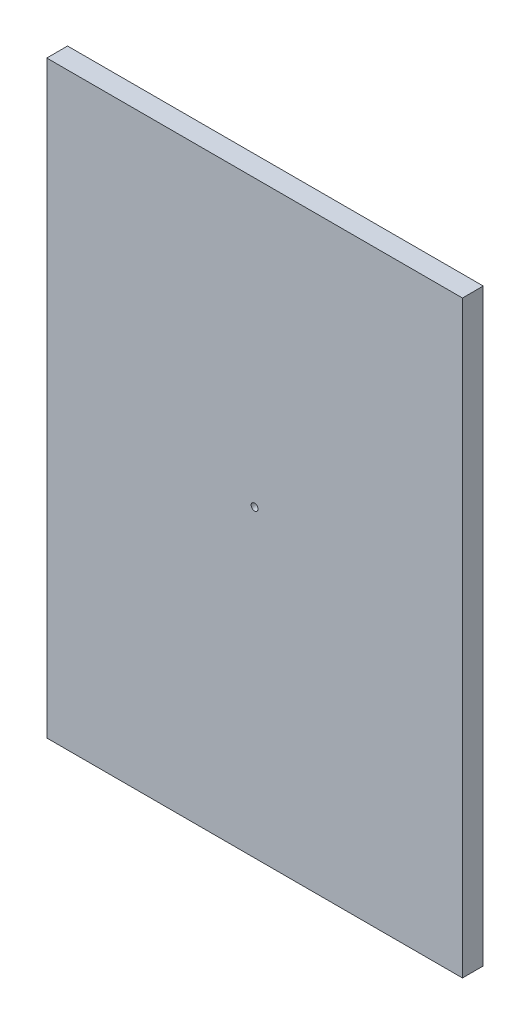
ISO-10303-21;
HEADER;
FILE_DESCRIPTION(('STEP AP214'),'2;1');
FILE_NAME('part.step','',(''),(''),'','','');
FILE_SCHEMA(('AUTOMOTIVE_DESIGN { 1 0 10303 214 1 1 1 1 }'));
ENDSEC;
DATA;
#1=APPLICATION_CONTEXT('core data for automotive mechanical design processes');
#2=APPLICATION_PROTOCOL_DEFINITION('international standard','automotive_design',2000,#1);
#3=PRODUCT_CONTEXT('',#1,'mechanical');
#4=PRODUCT('Part','Part','',(#3));
#5=PRODUCT_RELATED_PRODUCT_CATEGORY('part','',(#4));
#6=PRODUCT_DEFINITION_FORMATION('','',#4);
#7=PRODUCT_DEFINITION_CONTEXT('part definition',#1,'design');
#8=PRODUCT_DEFINITION('design','',#6,#7);
#9=PRODUCT_DEFINITION_SHAPE('','',#8);
#10=(LENGTH_UNIT() NAMED_UNIT(*) SI_UNIT(.MILLI.,.METRE.));
#11=(NAMED_UNIT(*) PLANE_ANGLE_UNIT() SI_UNIT($,.RADIAN.));
#12=(NAMED_UNIT(*) SI_UNIT($,.STERADIAN.) SOLID_ANGLE_UNIT());
#13=UNCERTAINTY_MEASURE_WITH_UNIT(LENGTH_MEASURE(1.E-05),#10,'distance_accuracy_value','');
#14=(GEOMETRIC_REPRESENTATION_CONTEXT(3) GLOBAL_UNCERTAINTY_ASSIGNED_CONTEXT((#13)) GLOBAL_UNIT_ASSIGNED_CONTEXT((#10,
#11,#12)) REPRESENTATION_CONTEXT('',''));
#15=CARTESIAN_POINT('',(0.,0.,0.));
#16=DIRECTION('',(0.,0.,1.));
#17=DIRECTION('',(1.,0.,0.));
#18=AXIS2_PLACEMENT_3D('',#15,#16,#17);
#19=CARTESIAN_POINT('',(60.,0.,3.));
#20=DIRECTION('',(1.,0.,0.));
#21=DIRECTION('',(0.,1.,0.));
#22=AXIS2_PLACEMENT_3D('',#19,#20,#21);
#23=PLANE('',#22);
#24=DIRECTION('',(0.,-1.,0.));
#25=VECTOR('',#24,1.);
#26=CARTESIAN_POINT('',(60.,0.,0.));
#27=LINE('',#26,#25);
#28=CARTESIAN_POINT('',(60.,0.,0.));
#29=VERTEX_POINT('',#28);
#30=CARTESIAN_POINT('',(60.,-85.,0.));
#31=VERTEX_POINT('',#30);
#32=EDGE_CURVE('E112',#29,#31,#27,.T.);
#33=ORIENTED_EDGE('',*,*,#32,.F.);
#34=DIRECTION('',(0.,0.,-1.));
#35=VECTOR('',#34,1.);
#36=CARTESIAN_POINT('',(60.,0.,3.));
#37=LINE('',#36,#35);
#38=CARTESIAN_POINT('',(60.,0.,3.));
#39=VERTEX_POINT('',#38);
#40=EDGE_CURVE('E11',#39,#29,#37,.T.);
#41=ORIENTED_EDGE('',*,*,#40,.F.);
#42=DIRECTION('',(0.,-1.,0.));
#43=VECTOR('',#42,1.);
#44=CARTESIAN_POINT('',(60.,0.,3.));
#45=LINE('',#44,#43);
#46=CARTESIAN_POINT('',(60.,-85.,3.));
#47=VERTEX_POINT('',#46);
#48=EDGE_CURVE('E102',#39,#47,#45,.T.);
#49=ORIENTED_EDGE('',*,*,#48,.T.);
#50=DIRECTION('',(0.,0.,-1.));
#51=VECTOR('',#50,1.);
#52=CARTESIAN_POINT('',(60.,-85.,3.));
#53=LINE('',#52,#51);
#54=EDGE_CURVE('E81',#47,#31,#53,.T.);
#55=ORIENTED_EDGE('',*,*,#54,.T.);
#56=EDGE_LOOP('',(#33,#41,#49,#55));
#57=FACE_BOUND('',#56,.T.);
#58=ADVANCED_FACE('F41',(#57),#23,.T.);
#59=CARTESIAN_POINT('',(0.,0.,3.));
#60=DIRECTION('',(0.,1.,0.));
#61=DIRECTION('',(0.,0.,1.));
#62=AXIS2_PLACEMENT_3D('',#59,#60,#61);
#63=PLANE('',#62);
#64=DIRECTION('',(1.,0.,0.));
#65=VECTOR('',#64,1.);
#66=CARTESIAN_POINT('',(0.,0.,0.));
#67=LINE('',#66,#65);
#68=CARTESIAN_POINT('',(0.,0.,0.));
#69=VERTEX_POINT('',#68);
#70=EDGE_CURVE('E93',#69,#29,#67,.T.);
#71=ORIENTED_EDGE('',*,*,#70,.F.);
#72=DIRECTION('',(0.,0.,-1.));
#73=VECTOR('',#72,1.);
#74=CARTESIAN_POINT('',(0.,0.,3.));
#75=LINE('',#74,#73);
#76=CARTESIAN_POINT('',(0.,0.,3.));
#77=VERTEX_POINT('',#76);
#78=EDGE_CURVE('E50',#77,#69,#75,.T.);
#79=ORIENTED_EDGE('',*,*,#78,.F.);
#80=DIRECTION('',(1.,0.,0.));
#81=VECTOR('',#80,1.);
#82=CARTESIAN_POINT('',(0.,0.,3.));
#83=LINE('',#82,#81);
#84=EDGE_CURVE('E91',#77,#39,#83,.T.);
#85=ORIENTED_EDGE('',*,*,#84,.T.);
#86=ORIENTED_EDGE('',*,*,#40,.T.);
#87=EDGE_LOOP('',(#71,#79,#85,#86));
#88=FACE_BOUND('',#87,.T.);
#89=ADVANCED_FACE('F89',(#88),#63,.T.);
#90=CARTESIAN_POINT('',(0.,0.,3.));
#91=DIRECTION('',(1.,0.,0.));
#92=DIRECTION('',(0.,1.,0.));
#93=AXIS2_PLACEMENT_3D('',#90,#91,#92);
#94=PLANE('',#93);
#95=DIRECTION('',(0.,-1.,0.));
#96=VECTOR('',#95,1.);
#97=CARTESIAN_POINT('',(0.,0.,0.));
#98=LINE('',#97,#96);
#99=CARTESIAN_POINT('',(0.,-85.,0.));
#100=VERTEX_POINT('',#99);
#101=EDGE_CURVE('E115',#69,#100,#98,.T.);
#102=ORIENTED_EDGE('',*,*,#101,.T.);
#103=DIRECTION('',(0.,0.,-1.));
#104=VECTOR('',#103,1.);
#105=CARTESIAN_POINT('',(0.,-85.,3.));
#106=LINE('',#105,#104);
#107=CARTESIAN_POINT('',(0.,-85.,3.));
#108=VERTEX_POINT('',#107);
#109=EDGE_CURVE('E96',#108,#100,#106,.T.);
#110=ORIENTED_EDGE('',*,*,#109,.F.);
#111=DIRECTION('',(0.,-1.,0.));
#112=VECTOR('',#111,1.);
#113=CARTESIAN_POINT('',(0.,0.,3.));
#114=LINE('',#113,#112);
#115=EDGE_CURVE('E98',#77,#108,#114,.T.);
#116=ORIENTED_EDGE('',*,*,#115,.F.);
#117=ORIENTED_EDGE('',*,*,#78,.T.);
#118=EDGE_LOOP('',(#102,#110,#116,#117));
#119=FACE_BOUND('',#118,.T.);
#120=ADVANCED_FACE('F99',(#119),#94,.F.);
#121=CARTESIAN_POINT('',(30.,-41.14,3.));
#122=DIRECTION('',(0.,0.,-1.));
#123=DIRECTION('',(-1.,0.,0.));
#124=AXIS2_PLACEMENT_3D('',#121,#122,#123);
#125=CYLINDRICAL_SURFACE('',#124,0.499999999999999);
#126=CARTESIAN_POINT('',(30.,-41.14,3.));
#127=DIRECTION('',(0.,0.,1.));
#128=DIRECTION('',(1.,0.,0.));
#129=AXIS2_PLACEMENT_3D('',#126,#127,#128);
#130=CIRCLE('',#129,0.499999999999999);
#131=CARTESIAN_POINT('',(30.5,-41.14,3.));
#132=VERTEX_POINT('',#131);
#133=EDGE_CURVE('E104',#132,#132,#130,.T.);
#134=ORIENTED_EDGE('',*,*,#133,.T.);
#135=EDGE_LOOP('',(#134));
#136=FACE_BOUND('',#135,.T.);
#137=CARTESIAN_POINT('',(30.,-41.14,0.));
#138=DIRECTION('',(0.,0.,1.));
#139=DIRECTION('',(1.,0.,0.));
#140=AXIS2_PLACEMENT_3D('',#137,#138,#139);
#141=CIRCLE('',#140,0.499999999999999);
#142=CARTESIAN_POINT('',(30.5,-41.14,0.));
#143=VERTEX_POINT('',#142);
#144=EDGE_CURVE('E109',#143,#143,#141,.T.);
#145=ORIENTED_EDGE('',*,*,#144,.F.);
#146=EDGE_LOOP('',(#145));
#147=FACE_BOUND('',#146,.T.);
#148=ADVANCED_FACE('F43',(#136,#147),#125,.F.);
#149=CARTESIAN_POINT('',(0.,-85.,3.));
#150=DIRECTION('',(0.,1.,0.));
#151=DIRECTION('',(0.,0.,1.));
#152=AXIS2_PLACEMENT_3D('',#149,#150,#151);
#153=PLANE('',#152);
#154=DIRECTION('',(1.,0.,0.));
#155=VECTOR('',#154,1.);
#156=CARTESIAN_POINT('',(0.,-85.,0.));
#157=LINE('',#156,#155);
#158=EDGE_CURVE('E74',#100,#31,#157,.T.);
#159=ORIENTED_EDGE('',*,*,#158,.T.);
#160=ORIENTED_EDGE('',*,*,#54,.F.);
#161=DIRECTION('',(1.,0.,0.));
#162=VECTOR('',#161,1.);
#163=CARTESIAN_POINT('',(0.,-85.,3.));
#164=LINE('',#163,#162);
#165=EDGE_CURVE('E58',#108,#47,#164,.T.);
#166=ORIENTED_EDGE('',*,*,#165,.F.);
#167=ORIENTED_EDGE('',*,*,#109,.T.);
#168=EDGE_LOOP('',(#159,#160,#166,#167));
#169=FACE_BOUND('',#168,.T.);
#170=ADVANCED_FACE('F120',(#169),#153,.F.);
#171=CARTESIAN_POINT('',(0.,0.,3.));
#172=DIRECTION('',(0.,0.,1.));
#173=DIRECTION('',(1.,0.,0.));
#174=AXIS2_PLACEMENT_3D('',#171,#172,#173);
#175=PLANE('',#174);
#176=ORIENTED_EDGE('',*,*,#133,.F.);
#177=EDGE_LOOP('',(#176));
#178=FACE_BOUND('',#177,.T.);
#179=ORIENTED_EDGE('',*,*,#48,.F.);
#180=ORIENTED_EDGE('',*,*,#84,.F.);
#181=ORIENTED_EDGE('',*,*,#115,.T.);
#182=ORIENTED_EDGE('',*,*,#165,.T.);
#183=EDGE_LOOP('',(#179,#180,#181,#182));
#184=FACE_BOUND('',#183,.T.);
#185=ADVANCED_FACE('F101',(#178,#184),#175,.T.);
#186=CARTESIAN_POINT('',(0.,0.,0.));
#187=DIRECTION('',(0.,0.,1.));
#188=DIRECTION('',(1.,0.,0.));
#189=AXIS2_PLACEMENT_3D('',#186,#187,#188);
#190=PLANE('',#189);
#191=ORIENTED_EDGE('',*,*,#144,.T.);
#192=EDGE_LOOP('',(#191));
#193=FACE_BOUND('',#192,.T.);
#194=ORIENTED_EDGE('',*,*,#32,.T.);
#195=ORIENTED_EDGE('',*,*,#158,.F.);
#196=ORIENTED_EDGE('',*,*,#101,.F.);
#197=ORIENTED_EDGE('',*,*,#70,.T.);
#198=EDGE_LOOP('',(#194,#195,#196,#197));
#199=FACE_BOUND('',#198,.T.);
#200=ADVANCED_FACE('F121',(#193,#199),#190,.F.);
#201=CLOSED_SHELL('',(#58,#89,#120,#148,#170,#185,#200));
#202=MANIFOLD_SOLID_BREP('B2',#201);
#203=ADVANCED_BREP_SHAPE_REPRESENTATION('',(#18,#202),#14);
#204=SHAPE_DEFINITION_REPRESENTATION(#9,#203);
ENDSEC;
END-ISO-10303-21;
